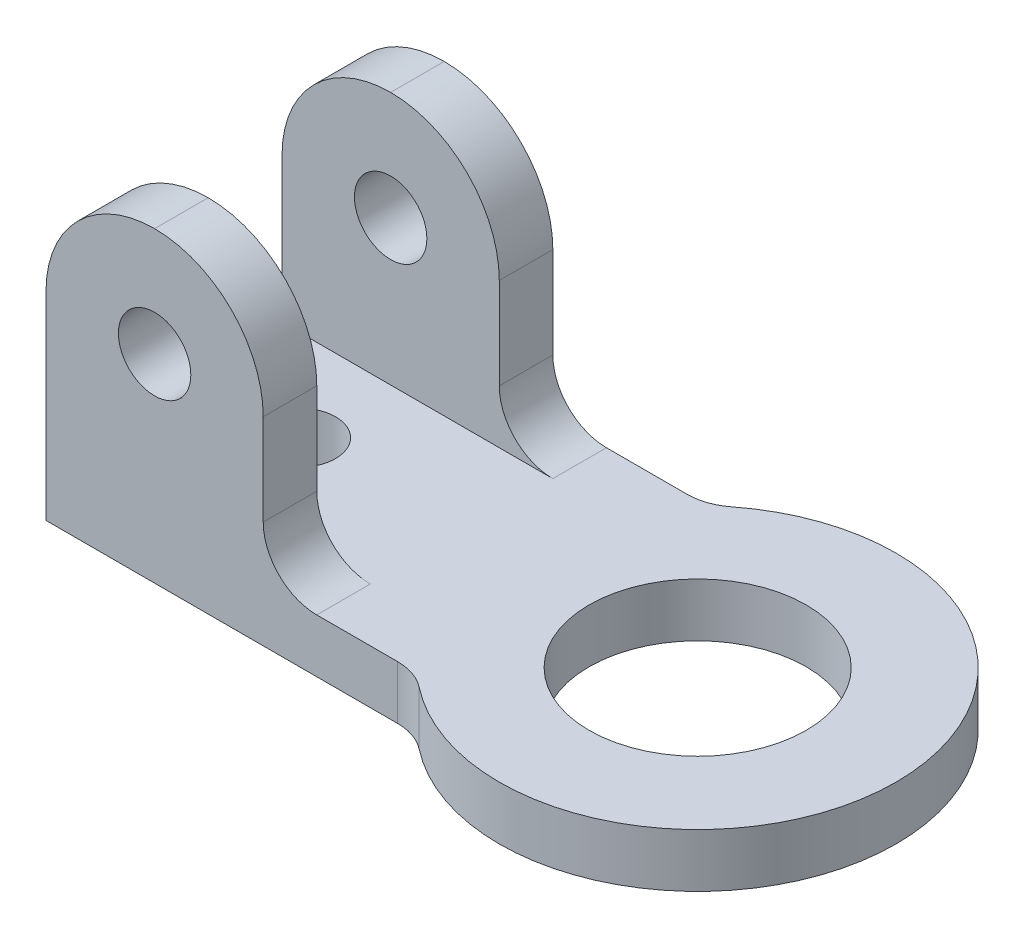
ISO-10303-21;
HEADER;
FILE_DESCRIPTION(('STEP AP214'),'2;1');
FILE_NAME('part.step','',(''),(''),'','','');
FILE_SCHEMA(('AUTOMOTIVE_DESIGN { 1 0 10303 214 1 1 1 1 }'));
ENDSEC;
DATA;
#1=APPLICATION_CONTEXT('core data for automotive mechanical design processes');
#2=APPLICATION_PROTOCOL_DEFINITION('international standard','automotive_design',2000,#1);
#3=PRODUCT_CONTEXT('',#1,'mechanical');
#4=PRODUCT('Part','Part','',(#3));
#5=PRODUCT_RELATED_PRODUCT_CATEGORY('part','',(#4));
#6=PRODUCT_DEFINITION_FORMATION('','',#4);
#7=PRODUCT_DEFINITION_CONTEXT('part definition',#1,'design');
#8=PRODUCT_DEFINITION('design','',#6,#7);
#9=PRODUCT_DEFINITION_SHAPE('','',#8);
#10=(LENGTH_UNIT() NAMED_UNIT(*) SI_UNIT(.MILLI.,.METRE.));
#11=(NAMED_UNIT(*) PLANE_ANGLE_UNIT() SI_UNIT($,.RADIAN.));
#12=(NAMED_UNIT(*) SI_UNIT($,.STERADIAN.) SOLID_ANGLE_UNIT());
#13=UNCERTAINTY_MEASURE_WITH_UNIT(LENGTH_MEASURE(1.E-05),#10,'distance_accuracy_value','');
#14=(GEOMETRIC_REPRESENTATION_CONTEXT(3) GLOBAL_UNCERTAINTY_ASSIGNED_CONTEXT((#13)) GLOBAL_UNIT_ASSIGNED_CONTEXT((#10,
#11,#12)) REPRESENTATION_CONTEXT('',''));
#15=CARTESIAN_POINT('',(0.,0.,0.));
#16=DIRECTION('',(0.,0.,1.));
#17=DIRECTION('',(1.,0.,0.));
#18=AXIS2_PLACEMENT_3D('',#15,#16,#17);
#19=CARTESIAN_POINT('',(0.,9.398,0.));
#20=DIRECTION('',(0.,1.,0.));
#21=DIRECTION('',(0.,0.,1.));
#22=AXIS2_PLACEMENT_3D('',#19,#20,#21);
#23=PLANE('',#22);
#24=CARTESIAN_POINT('',(0.,9.398,0.));
#25=DIRECTION('',(0.,1.,0.));
#26=DIRECTION('',(0.,0.,1.));
#27=AXIS2_PLACEMENT_3D('',#24,#25,#26);
#28=CIRCLE('',#27,19.05);
#29=CARTESIAN_POINT('',(0.,9.398,19.05));
#30=VERTEX_POINT('',#29);
#31=EDGE_CURVE('E175',#30,#30,#28,.T.);
#32=ORIENTED_EDGE('',*,*,#31,.F.);
#33=EDGE_LOOP('',(#32));
#34=FACE_BOUND('',#33,.T.);
#35=CARTESIAN_POINT('',(-69.85,9.398,0.));
#36=DIRECTION('',(0.,1.,0.));
#37=DIRECTION('',(0.,0.,1.));
#38=AXIS2_PLACEMENT_3D('',#35,#36,#37);
#39=CIRCLE('',#38,6.35);
#40=CARTESIAN_POINT('',(-69.85,9.398,6.35));
#41=VERTEX_POINT('',#40);
#42=EDGE_CURVE('E323',#41,#41,#39,.T.);
#43=ORIENTED_EDGE('',*,*,#42,.F.);
#44=EDGE_LOOP('',(#43));
#45=FACE_BOUND('',#44,.T.);
#46=DIRECTION('',(-1.,0.,0.));
#47=VECTOR('',#46,1.);
#48=CARTESIAN_POINT('',(-23.7853064726944,9.398,-25.4));
#49=LINE('',#48,#47);
#50=CARTESIAN_POINT('',(-27.2467541553118,9.398,-25.4));
#51=VERTEX_POINT('',#50);
#52=CARTESIAN_POINT('',(-41.402,9.398,-25.4));
#53=VERTEX_POINT('',#52);
#54=EDGE_CURVE('E189',#51,#53,#49,.T.);
#55=ORIENTED_EDGE('',*,*,#54,.T.);
#56=DIRECTION('',(0.,0.,-1.));
#57=VECTOR('',#56,1.);
#58=CARTESIAN_POINT('',(-41.402,9.398,0.));
#59=LINE('',#58,#57);
#60=CARTESIAN_POINT('',(-41.402,9.398,-16.002));
#61=VERTEX_POINT('',#60);
#62=EDGE_CURVE('E221',#53,#61,#59,.F.);
#63=ORIENTED_EDGE('',*,*,#62,.T.);
#64=DIRECTION('',(1.,0.,0.));
#65=VECTOR('',#64,1.);
#66=CARTESIAN_POINT('',(-88.9,9.398,-16.002));
#67=LINE('',#66,#65);
#68=CARTESIAN_POINT('',(-88.9,9.398,-16.002));
#69=VERTEX_POINT('',#68);
#70=EDGE_CURVE('E56',#69,#61,#67,.T.);
#71=ORIENTED_EDGE('',*,*,#70,.F.);
#72=DIRECTION('',(0.,0.,1.));
#73=VECTOR('',#72,1.);
#74=CARTESIAN_POINT('',(-88.9,9.398,-25.4));
#75=LINE('',#74,#73);
#76=CARTESIAN_POINT('',(-88.9,9.398,16.002));
#77=VERTEX_POINT('',#76);
#78=EDGE_CURVE('E188',#69,#77,#75,.T.);
#79=ORIENTED_EDGE('',*,*,#78,.T.);
#80=DIRECTION('',(-1.,0.,0.));
#81=VECTOR('',#80,1.);
#82=CARTESIAN_POINT('',(-88.9,9.398,16.002));
#83=LINE('',#82,#81);
#84=CARTESIAN_POINT('',(-41.402,9.398,16.002));
#85=VERTEX_POINT('',#84);
#86=EDGE_CURVE('E241',#85,#77,#83,.T.);
#87=ORIENTED_EDGE('',*,*,#86,.F.);
#88=DIRECTION('',(0.,0.,-1.));
#89=VECTOR('',#88,1.);
#90=CARTESIAN_POINT('',(-41.402,9.398,0.));
#91=LINE('',#90,#89);
#92=CARTESIAN_POINT('',(-41.402,9.398,25.4));
#93=VERTEX_POINT('',#92);
#94=EDGE_CURVE('E219',#85,#93,#91,.F.);
#95=ORIENTED_EDGE('',*,*,#94,.T.);
#96=DIRECTION('',(1.,0.,0.));
#97=VECTOR('',#96,1.);
#98=CARTESIAN_POINT('',(-23.7853064726944,9.398,25.4));
#99=LINE('',#98,#97);
#100=CARTESIAN_POINT('',(-27.2467541553118,9.398,25.4));
#101=VERTEX_POINT('',#100);
#102=EDGE_CURVE('E194',#93,#101,#99,.T.);
#103=ORIENTED_EDGE('',*,*,#102,.T.);
#104=CARTESIAN_POINT('',(-27.2467541553118,9.398,34.798));
#105=DIRECTION('',(0.,1.,0.));
#106=DIRECTION('',(0.,0.,1.));
#107=AXIS2_PLACEMENT_3D('',#104,#105,#106);
#108=CIRCLE('',#107,9.398);
#109=CARTESIAN_POINT('',(-21.45290413378,9.398,27.3984252873563));
#110=VERTEX_POINT('',#109);
#111=EDGE_CURVE('E226',#101,#110,#108,.F.);
#112=ORIENTED_EDGE('',*,*,#111,.T.);
#113=CARTESIAN_POINT('',(0.,9.398,0.));
#114=DIRECTION('',(0.,1.,0.));
#115=DIRECTION('',(0.,0.,1.));
#116=AXIS2_PLACEMENT_3D('',#113,#114,#115);
#117=CIRCLE('',#116,34.798);
#118=CARTESIAN_POINT('',(-21.45290413378,9.398,-27.3984252873563));
#119=VERTEX_POINT('',#118);
#120=EDGE_CURVE('E200',#110,#119,#117,.T.);
#121=ORIENTED_EDGE('',*,*,#120,.T.);
#122=CARTESIAN_POINT('',(-27.2467541553118,9.398,-34.798));
#123=DIRECTION('',(0.,1.,0.));
#124=DIRECTION('',(0.,0.,1.));
#125=AXIS2_PLACEMENT_3D('',#122,#123,#124);
#126=CIRCLE('',#125,9.398);
#127=EDGE_CURVE('E230',#119,#51,#126,.F.);
#128=ORIENTED_EDGE('',*,*,#127,.T.);
#129=EDGE_LOOP('',(#55,#63,#71,#79,#87,#95,#103,#112,#121,#128));
#130=FACE_BOUND('',#129,.T.);
#131=ADVANCED_FACE('F33',(#34,#45,#130),#23,.T.);
#132=CARTESIAN_POINT('',(0.,0.,0.));
#133=DIRECTION('',(0.,1.,0.));
#134=DIRECTION('',(0.,0.,1.));
#135=AXIS2_PLACEMENT_3D('',#132,#133,#134);
#136=PLANE('',#135);
#137=DIRECTION('',(0.,0.,1.));
#138=VECTOR('',#137,1.);
#139=CARTESIAN_POINT('',(-88.9,0.,-25.4));
#140=LINE('',#139,#138);
#141=CARTESIAN_POINT('',(-88.9,0.,-25.4));
#142=VERTEX_POINT('',#141);
#143=CARTESIAN_POINT('',(-88.9,0.,25.4));
#144=VERTEX_POINT('',#143);
#145=EDGE_CURVE('E166',#142,#144,#140,.T.);
#146=ORIENTED_EDGE('',*,*,#145,.F.);
#147=DIRECTION('',(-1.,0.,0.));
#148=VECTOR('',#147,1.);
#149=CARTESIAN_POINT('',(-23.7853064726944,0.,-25.4));
#150=LINE('',#149,#148);
#151=CARTESIAN_POINT('',(-27.2467541553118,0.,-25.4));
#152=VERTEX_POINT('',#151);
#153=EDGE_CURVE('E186',#152,#142,#150,.T.);
#154=ORIENTED_EDGE('',*,*,#153,.F.);
#155=CARTESIAN_POINT('',(-27.2467541553118,0.,-34.798));
#156=DIRECTION('',(0.,1.,0.));
#157=DIRECTION('',(0.,0.,1.));
#158=AXIS2_PLACEMENT_3D('',#155,#156,#157);
#159=CIRCLE('',#158,9.398);
#160=CARTESIAN_POINT('',(-21.45290413378,0.,-27.3984252873563));
#161=VERTEX_POINT('',#160);
#162=EDGE_CURVE('E228',#152,#161,#159,.T.);
#163=ORIENTED_EDGE('',*,*,#162,.T.);
#164=CARTESIAN_POINT('',(0.,0.,0.));
#165=DIRECTION('',(0.,1.,0.));
#166=DIRECTION('',(0.,0.,1.));
#167=AXIS2_PLACEMENT_3D('',#164,#165,#166);
#168=CIRCLE('',#167,34.798);
#169=CARTESIAN_POINT('',(-21.45290413378,0.,27.3984252873563));
#170=VERTEX_POINT('',#169);
#171=EDGE_CURVE('E169',#170,#161,#168,.T.);
#172=ORIENTED_EDGE('',*,*,#171,.F.);
#173=CARTESIAN_POINT('',(-27.2467541553118,0.,34.798));
#174=DIRECTION('',(0.,1.,0.));
#175=DIRECTION('',(0.,0.,1.));
#176=AXIS2_PLACEMENT_3D('',#173,#174,#175);
#177=CIRCLE('',#176,9.398);
#178=CARTESIAN_POINT('',(-27.2467541553118,0.,25.4));
#179=VERTEX_POINT('',#178);
#180=EDGE_CURVE('E168',#170,#179,#177,.T.);
#181=ORIENTED_EDGE('',*,*,#180,.T.);
#182=DIRECTION('',(1.,0.,0.));
#183=VECTOR('',#182,1.);
#184=CARTESIAN_POINT('',(-23.7853064726944,0.,25.4));
#185=LINE('',#184,#183);
#186=EDGE_CURVE('E150',#144,#179,#185,.T.);
#187=ORIENTED_EDGE('',*,*,#186,.F.);
#188=EDGE_LOOP('',(#146,#154,#163,#172,#181,#187));
#189=FACE_BOUND('',#188,.T.);
#190=CARTESIAN_POINT('',(0.,0.,0.));
#191=DIRECTION('',(0.,1.,0.));
#192=DIRECTION('',(0.,0.,1.));
#193=AXIS2_PLACEMENT_3D('',#190,#191,#192);
#194=CIRCLE('',#193,19.05);
#195=CARTESIAN_POINT('',(0.,0.,19.05));
#196=VERTEX_POINT('',#195);
#197=EDGE_CURVE('E178',#196,#196,#194,.T.);
#198=ORIENTED_EDGE('',*,*,#197,.T.);
#199=EDGE_LOOP('',(#198));
#200=FACE_BOUND('',#199,.T.);
#201=CARTESIAN_POINT('',(-69.85,0.,0.));
#202=DIRECTION('',(0.,1.,0.));
#203=DIRECTION('',(0.,0.,1.));
#204=AXIS2_PLACEMENT_3D('',#201,#202,#203);
#205=CIRCLE('',#204,6.35);
#206=CARTESIAN_POINT('',(-69.85,0.,6.35));
#207=VERTEX_POINT('',#206);
#208=EDGE_CURVE('E288',#207,#207,#205,.T.);
#209=ORIENTED_EDGE('',*,*,#208,.T.);
#210=EDGE_LOOP('',(#209));
#211=FACE_BOUND('',#210,.T.);
#212=ADVANCED_FACE('F163',(#189,#200,#211),#136,.F.);
#213=CARTESIAN_POINT('',(-88.9,9.398,-25.4));
#214=DIRECTION('',(1.,0.,0.));
#215=DIRECTION('',(0.,0.,-1.));
#216=AXIS2_PLACEMENT_3D('',#213,#214,#215);
#217=PLANE('',#216);
#218=DIRECTION('',(0.,-1.,0.));
#219=VECTOR('',#218,1.);
#220=CARTESIAN_POINT('',(-88.9,9.398,25.4));
#221=LINE('',#220,#219);
#222=CARTESIAN_POINT('',(-88.9,34.798,25.4));
#223=VERTEX_POINT('',#222);
#224=EDGE_CURVE('E147',#223,#144,#221,.T.);
#225=ORIENTED_EDGE('',*,*,#224,.F.);
#226=DIRECTION('',(0.,0.,1.));
#227=VECTOR('',#226,1.);
#228=CARTESIAN_POINT('',(-88.9,34.798,16.002));
#229=LINE('',#228,#227);
#230=CARTESIAN_POINT('',(-88.9,34.798,16.002));
#231=VERTEX_POINT('',#230);
#232=EDGE_CURVE('E290',#223,#231,#229,.F.);
#233=ORIENTED_EDGE('',*,*,#232,.T.);
#234=DIRECTION('',(0.,-1.,0.));
#235=VECTOR('',#234,1.);
#236=CARTESIAN_POINT('',(-88.9,53.848,16.002));
#237=LINE('',#236,#235);
#238=EDGE_CURVE('E392',#231,#77,#237,.T.);
#239=ORIENTED_EDGE('',*,*,#238,.T.);
#240=ORIENTED_EDGE('',*,*,#78,.F.);
#241=DIRECTION('',(0.,-1.,0.));
#242=VECTOR('',#241,1.);
#243=CARTESIAN_POINT('',(-88.9,53.848,-16.002));
#244=LINE('',#243,#242);
#245=CARTESIAN_POINT('',(-88.9,34.798,-16.002));
#246=VERTEX_POINT('',#245);
#247=EDGE_CURVE('E286',#246,#69,#244,.T.);
#248=ORIENTED_EDGE('',*,*,#247,.F.);
#249=DIRECTION('',(0.,0.,1.));
#250=VECTOR('',#249,1.);
#251=CARTESIAN_POINT('',(-88.9,34.798,-25.4));
#252=LINE('',#251,#250);
#253=CARTESIAN_POINT('',(-88.9,34.798,-25.4));
#254=VERTEX_POINT('',#253);
#255=EDGE_CURVE('E285',#246,#254,#252,.F.);
#256=ORIENTED_EDGE('',*,*,#255,.T.);
#257=DIRECTION('',(0.,-1.,0.));
#258=VECTOR('',#257,1.);
#259=CARTESIAN_POINT('',(-88.9,9.398,-25.4));
#260=LINE('',#259,#258);
#261=EDGE_CURVE('E159',#254,#142,#260,.T.);
#262=ORIENTED_EDGE('',*,*,#261,.T.);
#263=ORIENTED_EDGE('',*,*,#145,.T.);
#264=EDGE_LOOP('',(#225,#233,#239,#240,#248,#256,#262,#263));
#265=FACE_BOUND('',#264,.T.);
#266=ADVANCED_FACE('F172',(#265),#217,.F.);
#267=CARTESIAN_POINT('',(-23.7853064726944,9.398,25.4));
#268=DIRECTION('',(0.,0.,-1.));
#269=DIRECTION('',(-1.,0.,0.));
#270=AXIS2_PLACEMENT_3D('',#267,#268,#269);
#271=PLANE('',#270);
#272=CARTESIAN_POINT('',(-69.85,34.798,25.4));
#273=DIRECTION('',(0.,0.,1.));
#274=DIRECTION('',(1.,0.,0.));
#275=AXIS2_PLACEMENT_3D('',#272,#273,#274);
#276=CIRCLE('',#275,6.35);
#277=CARTESIAN_POINT('',(-63.5,34.798,25.4));
#278=VERTEX_POINT('',#277);
#279=EDGE_CURVE('E401',#278,#278,#276,.T.);
#280=ORIENTED_EDGE('',*,*,#279,.F.);
#281=EDGE_LOOP('',(#280));
#282=FACE_BOUND('',#281,.T.);
#283=ORIENTED_EDGE('',*,*,#186,.T.);
#284=DIRECTION('',(0.,1.,0.));
#285=VECTOR('',#284,1.);
#286=CARTESIAN_POINT('',(-27.2467541553118,9.398,25.4));
#287=LINE('',#286,#285);
#288=EDGE_CURVE('E211',#179,#101,#287,.T.);
#289=ORIENTED_EDGE('',*,*,#288,.T.);
#290=ORIENTED_EDGE('',*,*,#102,.F.);
#291=CARTESIAN_POINT('',(-41.402,18.796,25.4));
#292=DIRECTION('',(0.,0.,-1.));
#293=DIRECTION('',(-1.,0.,0.));
#294=AXIS2_PLACEMENT_3D('',#291,#292,#293);
#295=CIRCLE('',#294,9.398);
#296=CARTESIAN_POINT('',(-50.8,18.796,25.4));
#297=VERTEX_POINT('',#296);
#298=EDGE_CURVE('E11',#93,#297,#295,.T.);
#299=ORIENTED_EDGE('',*,*,#298,.T.);
#300=DIRECTION('',(0.,-1.,0.));
#301=VECTOR('',#300,1.);
#302=CARTESIAN_POINT('',(-50.8,53.848,25.4));
#303=LINE('',#302,#301);
#304=CARTESIAN_POINT('',(-50.8,34.798,25.4));
#305=VERTEX_POINT('',#304);
#306=EDGE_CURVE('E321',#305,#297,#303,.T.);
#307=ORIENTED_EDGE('',*,*,#306,.F.);
#308=CARTESIAN_POINT('',(-69.85,34.798,25.4));
#309=DIRECTION('',(0.,0.,-1.));
#310=DIRECTION('',(-1.,0.,0.));
#311=AXIS2_PLACEMENT_3D('',#308,#309,#310);
#312=CIRCLE('',#311,19.05);
#313=CARTESIAN_POINT('',(-69.85,53.848,25.4));
#314=VERTEX_POINT('',#313);
#315=EDGE_CURVE('E158',#305,#314,#312,.F.);
#316=ORIENTED_EDGE('',*,*,#315,.T.);
#317=CARTESIAN_POINT('',(-69.85,34.798,25.4));
#318=DIRECTION('',(0.,0.,-1.));
#319=DIRECTION('',(-1.,0.,0.));
#320=AXIS2_PLACEMENT_3D('',#317,#318,#319);
#321=CIRCLE('',#320,19.05);
#322=EDGE_CURVE('E153',#314,#223,#321,.F.);
#323=ORIENTED_EDGE('',*,*,#322,.T.);
#324=ORIENTED_EDGE('',*,*,#224,.T.);
#325=EDGE_LOOP('',(#283,#289,#290,#299,#307,#316,#323,#324));
#326=FACE_BOUND('',#325,.T.);
#327=ADVANCED_FACE('F149',(#282,#326),#271,.F.);
#328=CARTESIAN_POINT('',(0.,9.398,0.));
#329=DIRECTION('',(0.,-1.,0.));
#330=DIRECTION('',(0.,0.,-1.));
#331=AXIS2_PLACEMENT_3D('',#328,#329,#330);
#332=CYLINDRICAL_SURFACE('',#331,34.798);
#333=ORIENTED_EDGE('',*,*,#120,.F.);
#334=DIRECTION('',(0.,-1.,0.));
#335=VECTOR('',#334,1.);
#336=CARTESIAN_POINT('',(-21.45290413378,9.398,27.3984252873563));
#337=LINE('',#336,#335);
#338=EDGE_CURVE('E250',#110,#170,#337,.T.);
#339=ORIENTED_EDGE('',*,*,#338,.T.);
#340=ORIENTED_EDGE('',*,*,#171,.T.);
#341=DIRECTION('',(0.,-1.,0.));
#342=VECTOR('',#341,1.);
#343=CARTESIAN_POINT('',(-21.45290413378,9.398,-27.3984252873563));
#344=LINE('',#343,#342);
#345=EDGE_CURVE('E252',#161,#119,#344,.F.);
#346=ORIENTED_EDGE('',*,*,#345,.T.);
#347=EDGE_LOOP('',(#333,#339,#340,#346));
#348=FACE_BOUND('',#347,.T.);
#349=ADVANCED_FACE('F355',(#348),#332,.T.);
#350=CARTESIAN_POINT('',(-23.7853064726944,9.398,-25.4));
#351=DIRECTION('',(0.,0.,1.));
#352=DIRECTION('',(1.,0.,0.));
#353=AXIS2_PLACEMENT_3D('',#350,#351,#352);
#354=PLANE('',#353);
#355=CARTESIAN_POINT('',(-69.85,34.798,-25.4));
#356=DIRECTION('',(0.,0.,1.));
#357=DIRECTION('',(1.,0.,0.));
#358=AXIS2_PLACEMENT_3D('',#355,#356,#357);
#359=CIRCLE('',#358,6.35);
#360=CARTESIAN_POINT('',(-63.5,34.798,-25.4));
#361=VERTEX_POINT('',#360);
#362=EDGE_CURVE('E398',#361,#361,#359,.F.);
#363=ORIENTED_EDGE('',*,*,#362,.F.);
#364=EDGE_LOOP('',(#363));
#365=FACE_BOUND('',#364,.T.);
#366=ORIENTED_EDGE('',*,*,#54,.F.);
#367=DIRECTION('',(0.,1.,0.));
#368=VECTOR('',#367,1.);
#369=CARTESIAN_POINT('',(-27.2467541553118,0.,-25.4));
#370=LINE('',#369,#368);
#371=EDGE_CURVE('E213',#51,#152,#370,.F.);
#372=ORIENTED_EDGE('',*,*,#371,.T.);
#373=ORIENTED_EDGE('',*,*,#153,.T.);
#374=ORIENTED_EDGE('',*,*,#261,.F.);
#375=CARTESIAN_POINT('',(-69.85,34.798,-25.4));
#376=DIRECTION('',(0.,0.,1.));
#377=DIRECTION('',(1.,0.,0.));
#378=AXIS2_PLACEMENT_3D('',#375,#376,#377);
#379=CIRCLE('',#378,19.05);
#380=CARTESIAN_POINT('',(-69.85,53.848,-25.4));
#381=VERTEX_POINT('',#380);
#382=EDGE_CURVE('E268',#254,#381,#379,.F.);
#383=ORIENTED_EDGE('',*,*,#382,.T.);
#384=CARTESIAN_POINT('',(-69.85,34.798,-25.4));
#385=DIRECTION('',(0.,0.,1.));
#386=DIRECTION('',(1.,0.,0.));
#387=AXIS2_PLACEMENT_3D('',#384,#385,#386);
#388=CIRCLE('',#387,19.05);
#389=CARTESIAN_POINT('',(-50.8,34.798,-25.4));
#390=VERTEX_POINT('',#389);
#391=EDGE_CURVE('E270',#381,#390,#388,.F.);
#392=ORIENTED_EDGE('',*,*,#391,.T.);
#393=DIRECTION('',(0.,-1.,0.));
#394=VECTOR('',#393,1.);
#395=CARTESIAN_POINT('',(-50.8,53.848,-25.4));
#396=LINE('',#395,#394);
#397=CARTESIAN_POINT('',(-50.8,18.796,-25.4));
#398=VERTEX_POINT('',#397);
#399=EDGE_CURVE('E273',#390,#398,#396,.T.);
#400=ORIENTED_EDGE('',*,*,#399,.T.);
#401=CARTESIAN_POINT('',(-41.402,18.796,-25.4));
#402=DIRECTION('',(0.,0.,1.));
#403=DIRECTION('',(1.,0.,0.));
#404=AXIS2_PLACEMENT_3D('',#401,#402,#403);
#405=CIRCLE('',#404,9.398);
#406=EDGE_CURVE('E232',#398,#53,#405,.T.);
#407=ORIENTED_EDGE('',*,*,#406,.T.);
#408=EDGE_LOOP('',(#366,#372,#373,#374,#383,#392,#400,#407));
#409=FACE_BOUND('',#408,.T.);
#410=ADVANCED_FACE('F308',(#365,#409),#354,.F.);
#411=CARTESIAN_POINT('',(0.,9.398,0.));
#412=DIRECTION('',(0.,-1.,0.));
#413=DIRECTION('',(0.,0.,-1.));
#414=AXIS2_PLACEMENT_3D('',#411,#412,#413);
#415=CYLINDRICAL_SURFACE('',#414,19.05);
#416=ORIENTED_EDGE('',*,*,#31,.T.);
#417=EDGE_LOOP('',(#416));
#418=FACE_BOUND('',#417,.T.);
#419=ORIENTED_EDGE('',*,*,#197,.F.);
#420=EDGE_LOOP('',(#419));
#421=FACE_BOUND('',#420,.T.);
#422=ADVANCED_FACE('F332',(#418,#421),#415,.F.);
#423=CARTESIAN_POINT('',(-69.85,9.398,0.));
#424=DIRECTION('',(0.,-1.,0.));
#425=DIRECTION('',(0.,0.,-1.));
#426=AXIS2_PLACEMENT_3D('',#423,#424,#425);
#427=CYLINDRICAL_SURFACE('',#426,6.35);
#428=ORIENTED_EDGE('',*,*,#42,.T.);
#429=EDGE_LOOP('',(#428));
#430=FACE_BOUND('',#429,.T.);
#431=ORIENTED_EDGE('',*,*,#208,.F.);
#432=EDGE_LOOP('',(#431));
#433=FACE_BOUND('',#432,.T.);
#434=ADVANCED_FACE('F330',(#430,#433),#427,.F.);
#435=CARTESIAN_POINT('',(-88.9,53.848,-16.002));
#436=DIRECTION('',(0.,0.,-1.));
#437=DIRECTION('',(-1.,0.,0.));
#438=AXIS2_PLACEMENT_3D('',#435,#436,#437);
#439=PLANE('',#438);
#440=CARTESIAN_POINT('',(-69.85,34.798,-16.002));
#441=DIRECTION('',(0.,0.,-1.));
#442=DIRECTION('',(-1.,0.,0.));
#443=AXIS2_PLACEMENT_3D('',#440,#441,#442);
#444=CIRCLE('',#443,6.35);
#445=CARTESIAN_POINT('',(-76.2,34.798,-16.002));
#446=VERTEX_POINT('',#445);
#447=EDGE_CURVE('E262',#446,#446,#444,.T.);
#448=ORIENTED_EDGE('',*,*,#447,.T.);
#449=EDGE_LOOP('',(#448));
#450=FACE_BOUND('',#449,.T.);
#451=CARTESIAN_POINT('',(-69.85,34.798,-16.002));
#452=DIRECTION('',(0.,0.,-1.));
#453=DIRECTION('',(-1.,0.,0.));
#454=AXIS2_PLACEMENT_3D('',#451,#452,#453);
#455=CIRCLE('',#454,19.05);
#456=CARTESIAN_POINT('',(-50.8,34.798,-16.002));
#457=VERTEX_POINT('',#456);
#458=CARTESIAN_POINT('',(-69.85,53.848,-16.002));
#459=VERTEX_POINT('',#458);
#460=EDGE_CURVE('E295',#457,#459,#455,.F.);
#461=ORIENTED_EDGE('',*,*,#460,.T.);
#462=CARTESIAN_POINT('',(-69.85,34.798,-16.002));
#463=DIRECTION('',(0.,0.,-1.));
#464=DIRECTION('',(-1.,0.,0.));
#465=AXIS2_PLACEMENT_3D('',#462,#463,#464);
#466=CIRCLE('',#465,19.05);
#467=EDGE_CURVE('E272',#459,#246,#466,.F.);
#468=ORIENTED_EDGE('',*,*,#467,.T.);
#469=ORIENTED_EDGE('',*,*,#247,.T.);
#470=ORIENTED_EDGE('',*,*,#70,.T.);
#471=CARTESIAN_POINT('',(-41.402,18.796,-16.002));
#472=DIRECTION('',(0.,0.,-1.));
#473=DIRECTION('',(-1.,0.,0.));
#474=AXIS2_PLACEMENT_3D('',#471,#472,#473);
#475=CIRCLE('',#474,9.398);
#476=CARTESIAN_POINT('',(-50.8,18.796,-16.002));
#477=VERTEX_POINT('',#476);
#478=EDGE_CURVE('E234',#61,#477,#475,.T.);
#479=ORIENTED_EDGE('',*,*,#478,.T.);
#480=DIRECTION('',(0.,-1.,0.));
#481=VECTOR('',#480,1.);
#482=CARTESIAN_POINT('',(-50.8,53.848,-16.002));
#483=LINE('',#482,#481);
#484=EDGE_CURVE('E277',#457,#477,#483,.T.);
#485=ORIENTED_EDGE('',*,*,#484,.F.);
#486=EDGE_LOOP('',(#461,#468,#469,#470,#479,#485));
#487=FACE_BOUND('',#486,.T.);
#488=ADVANCED_FACE('F301',(#450,#487),#439,.F.);
#489=CARTESIAN_POINT('',(-50.8,53.848,-25.4));
#490=DIRECTION('',(-1.,0.,0.));
#491=DIRECTION('',(0.,0.,1.));
#492=AXIS2_PLACEMENT_3D('',#489,#490,#491);
#493=PLANE('',#492);
#494=ORIENTED_EDGE('',*,*,#484,.T.);
#495=DIRECTION('',(0.,0.,-1.));
#496=VECTOR('',#495,1.);
#497=CARTESIAN_POINT('',(-50.8,18.796,-25.4));
#498=LINE('',#497,#496);
#499=EDGE_CURVE('E216',#477,#398,#498,.T.);
#500=ORIENTED_EDGE('',*,*,#499,.T.);
#501=ORIENTED_EDGE('',*,*,#399,.F.);
#502=DIRECTION('',(0.,0.,-1.));
#503=VECTOR('',#502,1.);
#504=CARTESIAN_POINT('',(-50.8,34.798,-16.002));
#505=LINE('',#504,#503);
#506=EDGE_CURVE('E266',#390,#457,#505,.F.);
#507=ORIENTED_EDGE('',*,*,#506,.T.);
#508=EDGE_LOOP('',(#494,#500,#501,#507));
#509=FACE_BOUND('',#508,.T.);
#510=ADVANCED_FACE('F315',(#509),#493,.F.);
#511=CARTESIAN_POINT('',(-50.8,53.848,25.4));
#512=DIRECTION('',(-1.,0.,0.));
#513=DIRECTION('',(0.,0.,1.));
#514=AXIS2_PLACEMENT_3D('',#511,#512,#513);
#515=PLANE('',#514);
#516=ORIENTED_EDGE('',*,*,#306,.T.);
#517=DIRECTION('',(0.,0.,-1.));
#518=VECTOR('',#517,1.);
#519=CARTESIAN_POINT('',(-50.8,18.796,25.4));
#520=LINE('',#519,#518);
#521=CARTESIAN_POINT('',(-50.8,18.796,16.002));
#522=VERTEX_POINT('',#521);
#523=EDGE_CURVE('E223',#297,#522,#520,.T.);
#524=ORIENTED_EDGE('',*,*,#523,.T.);
#525=DIRECTION('',(0.,-1.,0.));
#526=VECTOR('',#525,1.);
#527=CARTESIAN_POINT('',(-50.8,53.848,16.002));
#528=LINE('',#527,#526);
#529=CARTESIAN_POINT('',(-50.8,34.798,16.002));
#530=VERTEX_POINT('',#529);
#531=EDGE_CURVE('E243',#530,#522,#528,.T.);
#532=ORIENTED_EDGE('',*,*,#531,.F.);
#533=DIRECTION('',(0.,0.,-1.));
#534=VECTOR('',#533,1.);
#535=CARTESIAN_POINT('',(-50.8,34.798,25.4));
#536=LINE('',#535,#534);
#537=EDGE_CURVE('E255',#530,#305,#536,.F.);
#538=ORIENTED_EDGE('',*,*,#537,.T.);
#539=EDGE_LOOP('',(#516,#524,#532,#538));
#540=FACE_BOUND('',#539,.T.);
#541=ADVANCED_FACE('F413',(#540),#515,.F.);
#542=CARTESIAN_POINT('',(-88.9,53.848,16.002));
#543=DIRECTION('',(0.,0.,1.));
#544=DIRECTION('',(1.,0.,0.));
#545=AXIS2_PLACEMENT_3D('',#542,#543,#544);
#546=PLANE('',#545);
#547=CARTESIAN_POINT('',(-69.85,34.798,16.002));
#548=DIRECTION('',(0.,0.,1.));
#549=DIRECTION('',(1.,0.,0.));
#550=AXIS2_PLACEMENT_3D('',#547,#548,#549);
#551=CIRCLE('',#550,6.35);
#552=CARTESIAN_POINT('',(-63.5,34.798,16.002));
#553=VERTEX_POINT('',#552);
#554=EDGE_CURVE('E37',#553,#553,#551,.T.);
#555=ORIENTED_EDGE('',*,*,#554,.T.);
#556=EDGE_LOOP('',(#555));
#557=FACE_BOUND('',#556,.T.);
#558=ORIENTED_EDGE('',*,*,#238,.F.);
#559=CARTESIAN_POINT('',(-69.85,34.798,16.002));
#560=DIRECTION('',(0.,0.,1.));
#561=DIRECTION('',(1.,0.,0.));
#562=AXIS2_PLACEMENT_3D('',#559,#560,#561);
#563=CIRCLE('',#562,19.05);
#564=CARTESIAN_POINT('',(-69.85,53.848,16.002));
#565=VERTEX_POINT('',#564);
#566=EDGE_CURVE('E294',#231,#565,#563,.F.);
#567=ORIENTED_EDGE('',*,*,#566,.T.);
#568=CARTESIAN_POINT('',(-69.85,34.798,16.002));
#569=DIRECTION('',(0.,0.,1.));
#570=DIRECTION('',(1.,0.,0.));
#571=AXIS2_PLACEMENT_3D('',#568,#569,#570);
#572=CIRCLE('',#571,19.05);
#573=EDGE_CURVE('E292',#565,#530,#572,.F.);
#574=ORIENTED_EDGE('',*,*,#573,.T.);
#575=ORIENTED_EDGE('',*,*,#531,.T.);
#576=CARTESIAN_POINT('',(-41.402,18.796,16.002));
#577=DIRECTION('',(0.,0.,1.));
#578=DIRECTION('',(1.,0.,0.));
#579=AXIS2_PLACEMENT_3D('',#576,#577,#578);
#580=CIRCLE('',#579,9.398);
#581=EDGE_CURVE('E42',#522,#85,#580,.T.);
#582=ORIENTED_EDGE('',*,*,#581,.T.);
#583=ORIENTED_EDGE('',*,*,#86,.T.);
#584=EDGE_LOOP('',(#558,#567,#574,#575,#582,#583));
#585=FACE_BOUND('',#584,.T.);
#586=ADVANCED_FACE('F240',(#557,#585),#546,.F.);
#587=CARTESIAN_POINT('',(-69.85,34.798,0.));
#588=DIRECTION('',(0.,0.,1.));
#589=DIRECTION('',(1.,0.,0.));
#590=AXIS2_PLACEMENT_3D('',#587,#588,#589);
#591=CYLINDRICAL_SURFACE('',#590,19.05);
#592=ORIENTED_EDGE('',*,*,#537,.F.);
#593=ORIENTED_EDGE('',*,*,#573,.F.);
#594=DIRECTION('',(0.,0.,-1.));
#595=VECTOR('',#594,1.);
#596=CARTESIAN_POINT('',(-69.85,53.848,16.002));
#597=LINE('',#596,#595);
#598=EDGE_CURVE('E261',#314,#565,#597,.T.);
#599=ORIENTED_EDGE('',*,*,#598,.F.);
#600=ORIENTED_EDGE('',*,*,#315,.F.);
#601=EDGE_LOOP('',(#592,#593,#599,#600));
#602=FACE_BOUND('',#601,.T.);
#603=ADVANCED_FACE('F367',(#602),#591,.T.);
#604=CARTESIAN_POINT('',(-69.85,34.798,0.));
#605=DIRECTION('',(0.,0.,-1.));
#606=DIRECTION('',(-1.,0.,0.));
#607=AXIS2_PLACEMENT_3D('',#604,#605,#606);
#608=CYLINDRICAL_SURFACE('',#607,19.05);
#609=ORIENTED_EDGE('',*,*,#566,.F.);
#610=ORIENTED_EDGE('',*,*,#232,.F.);
#611=ORIENTED_EDGE('',*,*,#322,.F.);
#612=ORIENTED_EDGE('',*,*,#598,.T.);
#613=EDGE_LOOP('',(#609,#610,#611,#612));
#614=FACE_BOUND('',#613,.T.);
#615=ADVANCED_FACE('F364',(#614),#608,.T.);
#616=CARTESIAN_POINT('',(-69.85,34.798,0.));
#617=DIRECTION('',(0.,0.,1.));
#618=DIRECTION('',(1.,0.,0.));
#619=AXIS2_PLACEMENT_3D('',#616,#617,#618);
#620=CYLINDRICAL_SURFACE('',#619,19.05);
#621=ORIENTED_EDGE('',*,*,#506,.F.);
#622=ORIENTED_EDGE('',*,*,#391,.F.);
#623=DIRECTION('',(0.,0.,-1.));
#624=VECTOR('',#623,1.);
#625=CARTESIAN_POINT('',(-69.85,53.848,-25.4));
#626=LINE('',#625,#624);
#627=EDGE_CURVE('E258',#459,#381,#626,.T.);
#628=ORIENTED_EDGE('',*,*,#627,.F.);
#629=ORIENTED_EDGE('',*,*,#460,.F.);
#630=EDGE_LOOP('',(#621,#622,#628,#629));
#631=FACE_BOUND('',#630,.T.);
#632=ADVANCED_FACE('F312',(#631),#620,.T.);
#633=CARTESIAN_POINT('',(-69.85,34.798,0.));
#634=DIRECTION('',(0.,0.,-1.));
#635=DIRECTION('',(-1.,0.,0.));
#636=AXIS2_PLACEMENT_3D('',#633,#634,#635);
#637=CYLINDRICAL_SURFACE('',#636,19.05);
#638=ORIENTED_EDGE('',*,*,#382,.F.);
#639=ORIENTED_EDGE('',*,*,#255,.F.);
#640=ORIENTED_EDGE('',*,*,#467,.F.);
#641=ORIENTED_EDGE('',*,*,#627,.T.);
#642=EDGE_LOOP('',(#638,#639,#640,#641));
#643=FACE_BOUND('',#642,.T.);
#644=ADVANCED_FACE('F305',(#643),#637,.T.);
#645=CARTESIAN_POINT('',(-27.2467541553118,9.398,34.798));
#646=DIRECTION('',(0.,-1.,0.));
#647=DIRECTION('',(0.,0.,-1.));
#648=AXIS2_PLACEMENT_3D('',#645,#646,#647);
#649=CYLINDRICAL_SURFACE('',#648,9.398);
#650=ORIENTED_EDGE('',*,*,#111,.F.);
#651=ORIENTED_EDGE('',*,*,#288,.F.);
#652=ORIENTED_EDGE('',*,*,#180,.F.);
#653=ORIENTED_EDGE('',*,*,#338,.F.);
#654=EDGE_LOOP('',(#650,#651,#652,#653));
#655=FACE_BOUND('',#654,.T.);
#656=ADVANCED_FACE('F374',(#655),#649,.F.);
#657=CARTESIAN_POINT('',(-27.2467541553118,9.398,-34.798));
#658=DIRECTION('',(0.,-1.,0.));
#659=DIRECTION('',(0.,0.,-1.));
#660=AXIS2_PLACEMENT_3D('',#657,#658,#659);
#661=CYLINDRICAL_SURFACE('',#660,9.398);
#662=ORIENTED_EDGE('',*,*,#127,.F.);
#663=ORIENTED_EDGE('',*,*,#345,.F.);
#664=ORIENTED_EDGE('',*,*,#162,.F.);
#665=ORIENTED_EDGE('',*,*,#371,.F.);
#666=EDGE_LOOP('',(#662,#663,#664,#665));
#667=FACE_BOUND('',#666,.T.);
#668=ADVANCED_FACE('F379',(#667),#661,.F.);
#669=CARTESIAN_POINT('',(-41.402,18.796,-25.4));
#670=DIRECTION('',(0.,0.,-1.));
#671=DIRECTION('',(-1.,0.,0.));
#672=AXIS2_PLACEMENT_3D('',#669,#670,#671);
#673=CYLINDRICAL_SURFACE('',#672,9.398);
#674=ORIENTED_EDGE('',*,*,#478,.F.);
#675=ORIENTED_EDGE('',*,*,#62,.F.);
#676=ORIENTED_EDGE('',*,*,#406,.F.);
#677=ORIENTED_EDGE('',*,*,#499,.F.);
#678=EDGE_LOOP('',(#674,#675,#676,#677));
#679=FACE_BOUND('',#678,.T.);
#680=ADVANCED_FACE('F381',(#679),#673,.F.);
#681=CARTESIAN_POINT('',(-41.402,18.796,25.4));
#682=DIRECTION('',(0.,0.,-1.));
#683=DIRECTION('',(-1.,0.,0.));
#684=AXIS2_PLACEMENT_3D('',#681,#682,#683);
#685=CYLINDRICAL_SURFACE('',#684,9.398);
#686=ORIENTED_EDGE('',*,*,#298,.F.);
#687=ORIENTED_EDGE('',*,*,#94,.F.);
#688=ORIENTED_EDGE('',*,*,#581,.F.);
#689=ORIENTED_EDGE('',*,*,#523,.F.);
#690=EDGE_LOOP('',(#686,#687,#688,#689));
#691=FACE_BOUND('',#690,.T.);
#692=ADVANCED_FACE('F35',(#691),#685,.F.);
#693=CARTESIAN_POINT('',(-69.85,34.798,-43.3605122421383));
#694=DIRECTION('',(0.,0.,1.));
#695=DIRECTION('',(1.,0.,0.));
#696=AXIS2_PLACEMENT_3D('',#693,#694,#695);
#697=CYLINDRICAL_SURFACE('',#696,6.35);
#698=ORIENTED_EDGE('',*,*,#279,.T.);
#699=EDGE_LOOP('',(#698));
#700=FACE_BOUND('',#699,.T.);
#701=ORIENTED_EDGE('',*,*,#554,.F.);
#702=EDGE_LOOP('',(#701));
#703=FACE_BOUND('',#702,.T.);
#704=ADVANCED_FACE('F388',(#700,#703),#697,.F.);
#705=ORIENTED_EDGE('',*,*,#362,.T.);
#706=EDGE_LOOP('',(#705));
#707=FACE_BOUND('',#706,.T.);
#708=ORIENTED_EDGE('',*,*,#447,.F.);
#709=EDGE_LOOP('',(#708));
#710=FACE_BOUND('',#709,.T.);
#711=ADVANCED_FACE('F407',(#707,#710),#697,.F.);
#712=CLOSED_SHELL('',(#131,#212,#266,#327,#349,#410,#422,#434,#488,#510,#541,#586,#603,#615,
#632,#644,#656,#668,#680,#692,#704,#711));
#713=MANIFOLD_SOLID_BREP('B2',#712);
#714=ADVANCED_BREP_SHAPE_REPRESENTATION('',(#18,#713),#14);
#715=SHAPE_DEFINITION_REPRESENTATION(#9,#714);
ENDSEC;
END-ISO-10303-21;
